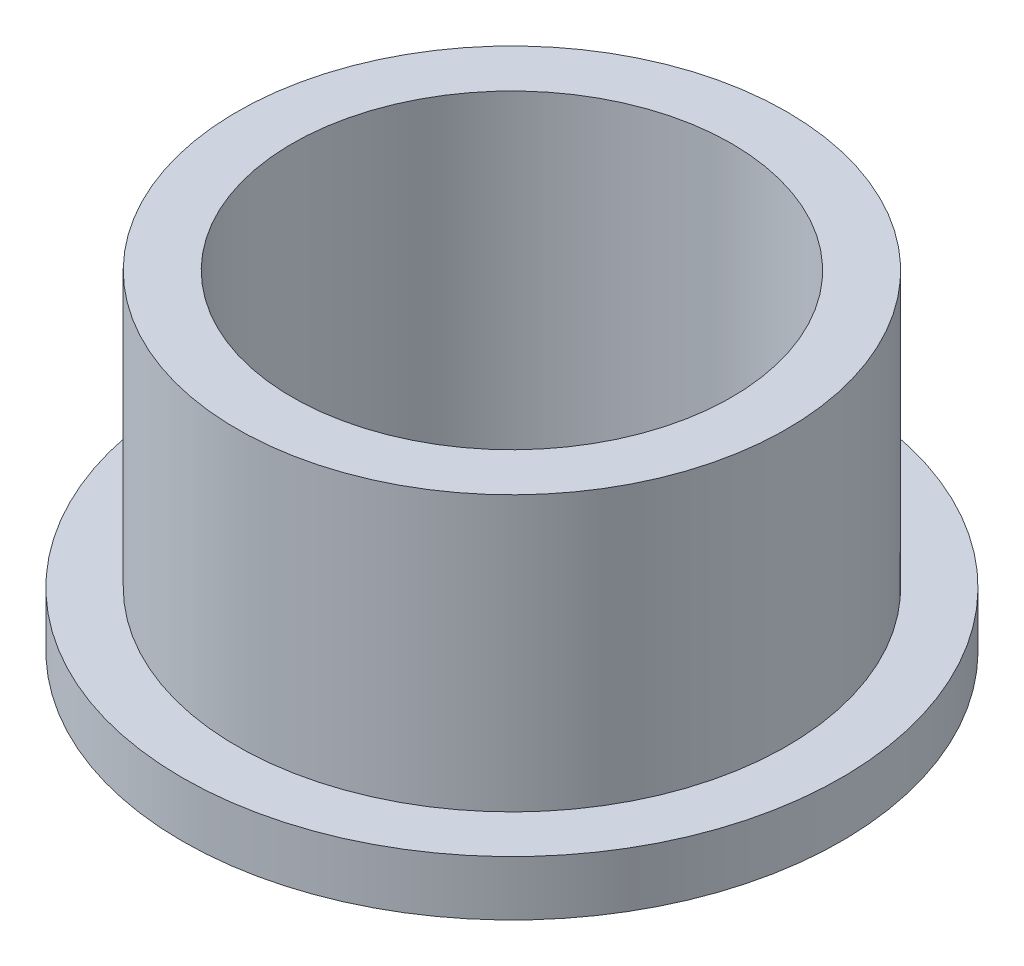
ISO-10303-21;
HEADER;
FILE_DESCRIPTION(('STEP AP214'),'2;1');
FILE_NAME('part.step','',(''),(''),'','','');
FILE_SCHEMA(('AUTOMOTIVE_DESIGN { 1 0 10303 214 1 1 1 1 }'));
ENDSEC;
DATA;
#1=APPLICATION_CONTEXT('core data for automotive mechanical design processes');
#2=APPLICATION_PROTOCOL_DEFINITION('international standard','automotive_design',2000,#1);
#3=PRODUCT_CONTEXT('',#1,'mechanical');
#4=PRODUCT('Part','Part','',(#3));
#5=PRODUCT_RELATED_PRODUCT_CATEGORY('part','',(#4));
#6=PRODUCT_DEFINITION_FORMATION('','',#4);
#7=PRODUCT_DEFINITION_CONTEXT('part definition',#1,'design');
#8=PRODUCT_DEFINITION('design','',#6,#7);
#9=PRODUCT_DEFINITION_SHAPE('','',#8);
#10=(LENGTH_UNIT() NAMED_UNIT(*) SI_UNIT(.MILLI.,.METRE.));
#11=(NAMED_UNIT(*) PLANE_ANGLE_UNIT() SI_UNIT($,.RADIAN.));
#12=(NAMED_UNIT(*) SI_UNIT($,.STERADIAN.) SOLID_ANGLE_UNIT());
#13=UNCERTAINTY_MEASURE_WITH_UNIT(LENGTH_MEASURE(1.E-05),#10,'distance_accuracy_value','');
#14=(GEOMETRIC_REPRESENTATION_CONTEXT(3) GLOBAL_UNCERTAINTY_ASSIGNED_CONTEXT((#13)) GLOBAL_UNIT_ASSIGNED_CONTEXT((#10,
#11,#12)) REPRESENTATION_CONTEXT('',''));
#15=CARTESIAN_POINT('',(0.,0.,0.));
#16=DIRECTION('',(0.,0.,1.));
#17=DIRECTION('',(1.,0.,0.));
#18=AXIS2_PLACEMENT_3D('',#15,#16,#17);
#19=CARTESIAN_POINT('',(0.,19.05,0.));
#20=DIRECTION('',(0.,1.,0.));
#21=DIRECTION('',(0.,0.,1.));
#22=AXIS2_PLACEMENT_3D('',#19,#20,#21);
#23=PLANE('',#22);
#24=CARTESIAN_POINT('',(0.,19.05,0.));
#25=DIRECTION('',(0.,1.,0.));
#26=DIRECTION('',(0.,0.,1.));
#27=AXIS2_PLACEMENT_3D('',#24,#25,#26);
#28=CIRCLE('',#27,15.8877);
#29=CARTESIAN_POINT('',(0.,19.05,-15.8877));
#30=VERTEX_POINT('',#29);
#31=EDGE_CURVE('E10',#30,#30,#28,.T.);
#32=ORIENTED_EDGE('',*,*,#31,.T.);
#33=EDGE_LOOP('',(#32));
#34=FACE_BOUND('',#33,.T.);
#35=CARTESIAN_POINT('',(0.,19.05,0.));
#36=DIRECTION('',(0.,1.,0.));
#37=DIRECTION('',(0.,0.,1.));
#38=AXIS2_PLACEMENT_3D('',#35,#36,#37);
#39=CIRCLE('',#38,12.7);
#40=CARTESIAN_POINT('',(0.,19.05,-12.7));
#41=VERTEX_POINT('',#40);
#42=EDGE_CURVE('E37',#41,#41,#39,.T.);
#43=ORIENTED_EDGE('',*,*,#42,.F.);
#44=EDGE_LOOP('',(#43));
#45=FACE_BOUND('',#44,.T.);
#46=ADVANCED_FACE('F30',(#34,#45),#23,.T.);
#47=CARTESIAN_POINT('',(0.,0.,0.));
#48=DIRECTION('',(0.,1.,0.));
#49=DIRECTION('',(0.,0.,1.));
#50=AXIS2_PLACEMENT_3D('',#47,#48,#49);
#51=PLANE('',#50);
#52=CARTESIAN_POINT('',(0.,0.,0.));
#53=DIRECTION('',(0.,1.,0.));
#54=DIRECTION('',(0.,0.,1.));
#55=AXIS2_PLACEMENT_3D('',#52,#53,#54);
#56=CIRCLE('',#55,12.7);
#57=CARTESIAN_POINT('',(0.,0.,-12.7));
#58=VERTEX_POINT('',#57);
#59=EDGE_CURVE('E41',#58,#58,#56,.T.);
#60=ORIENTED_EDGE('',*,*,#59,.T.);
#61=EDGE_LOOP('',(#60));
#62=FACE_BOUND('',#61,.T.);
#63=CARTESIAN_POINT('',(0.,0.,0.));
#64=DIRECTION('',(0.,1.,0.));
#65=DIRECTION('',(0.,0.,1.));
#66=AXIS2_PLACEMENT_3D('',#63,#64,#65);
#67=CIRCLE('',#66,19.05);
#68=CARTESIAN_POINT('',(0.,0.,19.05));
#69=VERTEX_POINT('',#68);
#70=EDGE_CURVE('E48',#69,#69,#67,.T.);
#71=ORIENTED_EDGE('',*,*,#70,.F.);
#72=EDGE_LOOP('',(#71));
#73=FACE_BOUND('',#72,.T.);
#74=ADVANCED_FACE('F73',(#62,#73),#51,.F.);
#75=CARTESIAN_POINT('',(0.,19.05,0.));
#76=DIRECTION('',(0.,-1.,0.));
#77=DIRECTION('',(0.,0.,-1.));
#78=AXIS2_PLACEMENT_3D('',#75,#76,#77);
#79=CYLINDRICAL_SURFACE('',#78,15.8877);
#80=CARTESIAN_POINT('',(0.,3.175,0.));
#81=DIRECTION('',(0.,1.,0.));
#82=DIRECTION('',(0.,0.,1.));
#83=AXIS2_PLACEMENT_3D('',#80,#81,#82);
#84=CIRCLE('',#83,15.8877);
#85=CARTESIAN_POINT('',(0.,3.175,-15.8877));
#86=VERTEX_POINT('',#85);
#87=EDGE_CURVE('E51',#86,#86,#84,.T.);
#88=CARTESIAN_POINT('',(0.,3.175,-15.8877));
#89=CARTESIAN_POINT('',(0.,3.34036458333333,-15.8877));
#90=CARTESIAN_POINT('',(0.,3.50572916666666,-15.8877));
#91=CARTESIAN_POINT('',(0.,3.83645833333333,-15.8877));
#92=CARTESIAN_POINT('',(0.,4.00182291666666,-15.8877));
#93=CARTESIAN_POINT('',(0.,4.33255208333333,-15.8877));
#94=CARTESIAN_POINT('',(0.,4.49791666666666,-15.8877));
#95=CARTESIAN_POINT('',(0.,4.82864583333333,-15.8877));
#96=CARTESIAN_POINT('',(0.,4.99401041666666,-15.8877));
#97=CARTESIAN_POINT('',(0.,5.32473958333333,-15.8877));
#98=CARTESIAN_POINT('',(0.,5.49010416666666,-15.8877));
#99=CARTESIAN_POINT('',(0.,5.82083333333333,-15.8877));
#100=CARTESIAN_POINT('',(0.,5.98619791666666,-15.8877));
#101=CARTESIAN_POINT('',(0.,6.31692708333333,-15.8877));
#102=CARTESIAN_POINT('',(0.,6.48229166666666,-15.8877));
#103=CARTESIAN_POINT('',(0.,6.81302083333333,-15.8877));
#104=CARTESIAN_POINT('',(0.,6.97838541666666,-15.8877));
#105=CARTESIAN_POINT('',(0.,7.30911458333333,-15.8877));
#106=CARTESIAN_POINT('',(0.,7.47447916666666,-15.8877));
#107=CARTESIAN_POINT('',(0.,7.80520833333333,-15.8877));
#108=CARTESIAN_POINT('',(0.,7.97057291666666,-15.8877));
#109=CARTESIAN_POINT('',(0.,8.30130208333333,-15.8877));
#110=CARTESIAN_POINT('',(0.,8.46666666666666,-15.8877));
#111=CARTESIAN_POINT('',(0.,8.79739583333333,-15.8877));
#112=CARTESIAN_POINT('',(0.,8.96276041666666,-15.8877));
#113=CARTESIAN_POINT('',(0.,9.29348958333333,-15.8877));
#114=CARTESIAN_POINT('',(0.,9.45885416666666,-15.8877));
#115=CARTESIAN_POINT('',(0.,9.78958333333333,-15.8877));
#116=CARTESIAN_POINT('',(0.,9.95494791666667,-15.8877));
#117=CARTESIAN_POINT('',(0.,10.2856770833333,-15.8877));
#118=CARTESIAN_POINT('',(0.,10.4510416666667,-15.8877));
#119=CARTESIAN_POINT('',(0.,10.7817708333333,-15.8877));
#120=CARTESIAN_POINT('',(0.,10.9471354166667,-15.8877));
#121=CARTESIAN_POINT('',(0.,11.2778645833333,-15.8877));
#122=CARTESIAN_POINT('',(0.,11.4432291666667,-15.8877));
#123=CARTESIAN_POINT('',(0.,11.7739583333333,-15.8877));
#124=CARTESIAN_POINT('',(0.,11.9393229166667,-15.8877));
#125=CARTESIAN_POINT('',(0.,12.2700520833333,-15.8877));
#126=CARTESIAN_POINT('',(0.,12.4354166666667,-15.8877));
#127=CARTESIAN_POINT('',(0.,12.7661458333333,-15.8877));
#128=CARTESIAN_POINT('',(0.,12.9315104166667,-15.8877));
#129=CARTESIAN_POINT('',(0.,13.2622395833333,-15.8877));
#130=CARTESIAN_POINT('',(0.,13.4276041666667,-15.8877));
#131=CARTESIAN_POINT('',(0.,13.7583333333333,-15.8877));
#132=CARTESIAN_POINT('',(0.,13.9236979166667,-15.8877));
#133=CARTESIAN_POINT('',(0.,14.2544270833333,-15.8877));
#134=CARTESIAN_POINT('',(0.,14.4197916666667,-15.8877));
#135=CARTESIAN_POINT('',(0.,14.7505208333333,-15.8877));
#136=CARTESIAN_POINT('',(0.,14.9158854166667,-15.8877));
#137=CARTESIAN_POINT('',(0.,15.2466145833333,-15.8877));
#138=CARTESIAN_POINT('',(0.,15.4119791666667,-15.8877));
#139=CARTESIAN_POINT('',(0.,15.7427083333333,-15.8877));
#140=CARTESIAN_POINT('',(0.,15.9080729166667,-15.8877));
#141=CARTESIAN_POINT('',(0.,16.2388020833333,-15.8877));
#142=CARTESIAN_POINT('',(0.,16.4041666666667,-15.8877));
#143=CARTESIAN_POINT('',(0.,16.7348958333333,-15.8877));
#144=CARTESIAN_POINT('',(0.,16.9002604166667,-15.8877));
#145=CARTESIAN_POINT('',(0.,17.2309895833333,-15.8877));
#146=CARTESIAN_POINT('',(0.,17.3963541666667,-15.8877));
#147=CARTESIAN_POINT('',(0.,17.7270833333333,-15.8877));
#148=CARTESIAN_POINT('',(0.,17.8924479166667,-15.8877));
#149=CARTESIAN_POINT('',(0.,18.2231770833333,-15.8877));
#150=CARTESIAN_POINT('',(0.,18.3885416666667,-15.8877));
#151=CARTESIAN_POINT('',(0.,18.7192708333333,-15.8877));
#152=CARTESIAN_POINT('',(0.,18.8846354166667,-15.8877));
#153=CARTESIAN_POINT('',(0.,19.05,-15.8877));
#154=B_SPLINE_CURVE_WITH_KNOTS('',3,(#88,#89,#90,#91,#92,#93,#94,#95,#96,#97,#98,#99,#100,#101,
#102,#103,#104,#105,#106,#107,#108,#109,#110,#111,#112,#113,#114,#115,#116,#117,#118,#119,#120,
#121,#122,#123,#124,#125,#126,#127,#128,#129,#130,#131,#132,#133,#134,#135,#136,#137,#138,#139,
#140,#141,#142,#143,#144,#145,#146,#147,#148,#149,#150,#151,#152,#153),.UNSPECIFIED.,.F.,.F.,(4,
2,2,2,2,2,2,2,2,2,2,2,2,2,2,2,2,2,2,2,2,2,2,2,2,2,2,2,2,2,2,2,4),(0.,0.496093749999999,
0.992187499999998,1.48828125,1.984375,2.48046875,2.9765625,3.47265625,3.96875,4.46484375,
4.9609375,5.45703125,5.953125,6.44921875,6.9453125,7.44140625,7.9375,8.43359375,8.9296875,
9.42578125,9.921875,10.41796875,10.9140625,11.41015625,11.90625,12.40234375,12.8984375,
13.39453125,13.890625,14.38671875,14.8828125,15.37890625,15.875),.UNSPECIFIED.);
#155=EDGE_CURVE('BSEAM32',#86,#30,#154,.T.);
#156=ORIENTED_EDGE('',*,*,#87,.T.);
#157=ORIENTED_EDGE('',*,*,#31,.F.);
#158=ORIENTED_EDGE('',*,*,#155,.T.);
#159=ORIENTED_EDGE('',*,*,#155,.F.);
#160=EDGE_LOOP('',(#156,#158,#157,#159));
#161=FACE_BOUND('',#160,.T.);
#162=ADVANCED_FACE('F32',(#161),#79,.T.);
#163=CARTESIAN_POINT('',(0.,19.05,0.));
#164=DIRECTION('',(0.,-1.,0.));
#165=DIRECTION('',(0.,0.,-1.));
#166=AXIS2_PLACEMENT_3D('',#163,#164,#165);
#167=CYLINDRICAL_SURFACE('',#166,12.7);
#168=CARTESIAN_POINT('',(0.,19.05,-12.7));
#169=CARTESIAN_POINT('',(0.,18.8515625,-12.7));
#170=CARTESIAN_POINT('',(0.,18.653125,-12.7));
#171=CARTESIAN_POINT('',(0.,18.25625,-12.7));
#172=CARTESIAN_POINT('',(0.,18.0578125,-12.7));
#173=CARTESIAN_POINT('',(0.,17.6609375,-12.7));
#174=CARTESIAN_POINT('',(0.,17.4625,-12.7));
#175=CARTESIAN_POINT('',(0.,17.065625,-12.7));
#176=CARTESIAN_POINT('',(0.,16.8671875,-12.7));
#177=CARTESIAN_POINT('',(0.,16.4703125,-12.7));
#178=CARTESIAN_POINT('',(0.,16.271875,-12.7));
#179=CARTESIAN_POINT('',(0.,15.875,-12.7));
#180=CARTESIAN_POINT('',(0.,15.6765625,-12.7));
#181=CARTESIAN_POINT('',(0.,15.2796875,-12.7));
#182=CARTESIAN_POINT('',(0.,15.08125,-12.7));
#183=CARTESIAN_POINT('',(0.,14.684375,-12.7));
#184=CARTESIAN_POINT('',(0.,14.4859375,-12.7));
#185=CARTESIAN_POINT('',(0.,14.0890625,-12.7));
#186=CARTESIAN_POINT('',(0.,13.890625,-12.7));
#187=CARTESIAN_POINT('',(0.,13.49375,-12.7));
#188=CARTESIAN_POINT('',(0.,13.2953125,-12.7));
#189=CARTESIAN_POINT('',(0.,12.8984375,-12.7));
#190=CARTESIAN_POINT('',(0.,12.7,-12.7));
#191=CARTESIAN_POINT('',(0.,12.303125,-12.7));
#192=CARTESIAN_POINT('',(0.,12.1046875,-12.7));
#193=CARTESIAN_POINT('',(0.,11.7078125,-12.7));
#194=CARTESIAN_POINT('',(0.,11.509375,-12.7));
#195=CARTESIAN_POINT('',(0.,11.1125,-12.7));
#196=CARTESIAN_POINT('',(0.,10.9140625,-12.7));
#197=CARTESIAN_POINT('',(0.,10.5171875,-12.7));
#198=CARTESIAN_POINT('',(0.,10.31875,-12.7));
#199=CARTESIAN_POINT('',(0.,9.921875,-12.7));
#200=CARTESIAN_POINT('',(0.,9.7234375,-12.7));
#201=CARTESIAN_POINT('',(0.,9.3265625,-12.7));
#202=CARTESIAN_POINT('',(0.,9.128125,-12.7));
#203=CARTESIAN_POINT('',(0.,8.73125,-12.7));
#204=CARTESIAN_POINT('',(0.,8.5328125,-12.7));
#205=CARTESIAN_POINT('',(0.,8.1359375,-12.7));
#206=CARTESIAN_POINT('',(0.,7.9375,-12.7));
#207=CARTESIAN_POINT('',(0.,7.540625,-12.7));
#208=CARTESIAN_POINT('',(0.,7.3421875,-12.7));
#209=CARTESIAN_POINT('',(0.,6.9453125,-12.7));
#210=CARTESIAN_POINT('',(0.,6.746875,-12.7));
#211=CARTESIAN_POINT('',(0.,6.35,-12.7));
#212=CARTESIAN_POINT('',(0.,6.1515625,-12.7));
#213=CARTESIAN_POINT('',(0.,5.7546875,-12.7));
#214=CARTESIAN_POINT('',(0.,5.55625,-12.7));
#215=CARTESIAN_POINT('',(0.,5.159375,-12.7));
#216=CARTESIAN_POINT('',(0.,4.9609375,-12.7));
#217=CARTESIAN_POINT('',(0.,4.5640625,-12.7));
#218=CARTESIAN_POINT('',(0.,4.365625,-12.7));
#219=CARTESIAN_POINT('',(0.,3.96875,-12.7));
#220=CARTESIAN_POINT('',(0.,3.7703125,-12.7));
#221=CARTESIAN_POINT('',(0.,3.3734375,-12.7));
#222=CARTESIAN_POINT('',(0.,3.175,-12.7));
#223=CARTESIAN_POINT('',(0.,2.778125,-12.7));
#224=CARTESIAN_POINT('',(0.,2.5796875,-12.7));
#225=CARTESIAN_POINT('',(0.,2.1828125,-12.7));
#226=CARTESIAN_POINT('',(0.,1.984375,-12.7));
#227=CARTESIAN_POINT('',(0.,1.5875,-12.7));
#228=CARTESIAN_POINT('',(0.,1.3890625,-12.7));
#229=CARTESIAN_POINT('',(0.,0.992187500000001,-12.7));
#230=CARTESIAN_POINT('',(0.,0.793750000000001,-12.7));
#231=CARTESIAN_POINT('',(0.,0.396875,-12.7));
#232=CARTESIAN_POINT('',(0.,0.1984375,-12.7));
#233=CARTESIAN_POINT('',(0.,0.,-12.7));
#234=B_SPLINE_CURVE_WITH_KNOTS('',3,(#168,#169,#170,#171,#172,#173,#174,#175,#176,#177,#178,
#179,#180,#181,#182,#183,#184,#185,#186,#187,#188,#189,#190,#191,#192,#193,#194,#195,#196,#197,
#198,#199,#200,#201,#202,#203,#204,#205,#206,#207,#208,#209,#210,#211,#212,#213,#214,#215,#216,
#217,#218,#219,#220,#221,#222,#223,#224,#225,#226,#227,#228,#229,#230,#231,#232,#233),
.UNSPECIFIED.,.F.,.F.,(4,2,2,2,2,2,2,2,2,2,2,2,2,2,2,2,2,2,2,2,2,2,2,2,2,2,2,2,2,2,2,2,4),(0.,
0.595312499999997,1.190625,1.7859375,2.38125,2.9765625,3.571875,4.1671875,4.7625,5.3578125,
5.953125,6.5484375,7.14375,7.7390625,8.334375,8.9296875,9.525,10.1203125,10.715625,11.3109375,
11.90625,12.5015625,13.096875,13.6921875,14.2875,14.8828125,15.478125,16.0734375,16.66875,
17.2640625,17.859375,18.4546875,19.05),.UNSPECIFIED.);
#235=EDGE_CURVE('BSEAM62',#41,#58,#234,.T.);
#236=ORIENTED_EDGE('',*,*,#42,.T.);
#237=ORIENTED_EDGE('',*,*,#59,.F.);
#238=ORIENTED_EDGE('',*,*,#235,.T.);
#239=ORIENTED_EDGE('',*,*,#235,.F.);
#240=EDGE_LOOP('',(#236,#238,#237,#239));
#241=FACE_BOUND('',#240,.T.);
#242=ADVANCED_FACE('F62',(#241),#167,.F.);
#243=CARTESIAN_POINT('',(0.,3.175,0.));
#244=DIRECTION('',(0.,1.,0.));
#245=DIRECTION('',(0.,0.,1.));
#246=AXIS2_PLACEMENT_3D('',#243,#244,#245);
#247=PLANE('',#246);
#248=CARTESIAN_POINT('',(0.,3.175,0.));
#249=DIRECTION('',(0.,1.,0.));
#250=DIRECTION('',(0.,0.,1.));
#251=AXIS2_PLACEMENT_3D('',#248,#249,#250);
#252=CIRCLE('',#251,19.05);
#253=CARTESIAN_POINT('',(0.,3.175,19.05));
#254=VERTEX_POINT('',#253);
#255=EDGE_CURVE('E46',#254,#254,#252,.T.);
#256=ORIENTED_EDGE('',*,*,#255,.T.);
#257=EDGE_LOOP('',(#256));
#258=FACE_BOUND('',#257,.T.);
#259=ORIENTED_EDGE('',*,*,#87,.F.);
#260=EDGE_LOOP('',(#259));
#261=FACE_BOUND('',#260,.T.);
#262=ADVANCED_FACE('F59',(#258,#261),#247,.T.);
#263=CARTESIAN_POINT('',(0.,3.175,0.));
#264=DIRECTION('',(0.,-1.,0.));
#265=DIRECTION('',(0.,0.,-1.));
#266=AXIS2_PLACEMENT_3D('',#263,#264,#265);
#267=CYLINDRICAL_SURFACE('',#266,19.05);
#268=ORIENTED_EDGE('',*,*,#255,.F.);
#269=EDGE_LOOP('',(#268));
#270=FACE_BOUND('',#269,.T.);
#271=ORIENTED_EDGE('',*,*,#70,.T.);
#272=EDGE_LOOP('',(#271));
#273=FACE_BOUND('',#272,.T.);
#274=ADVANCED_FACE('F61',(#270,#273),#267,.T.);
#275=CLOSED_SHELL('',(#46,#74,#162,#242,#262,#274));
#276=MANIFOLD_SOLID_BREP('B2',#275);
#277=ADVANCED_BREP_SHAPE_REPRESENTATION('',(#18,#276),#14);
#278=SHAPE_DEFINITION_REPRESENTATION(#9,#277);
ENDSEC;
END-ISO-10303-21;
